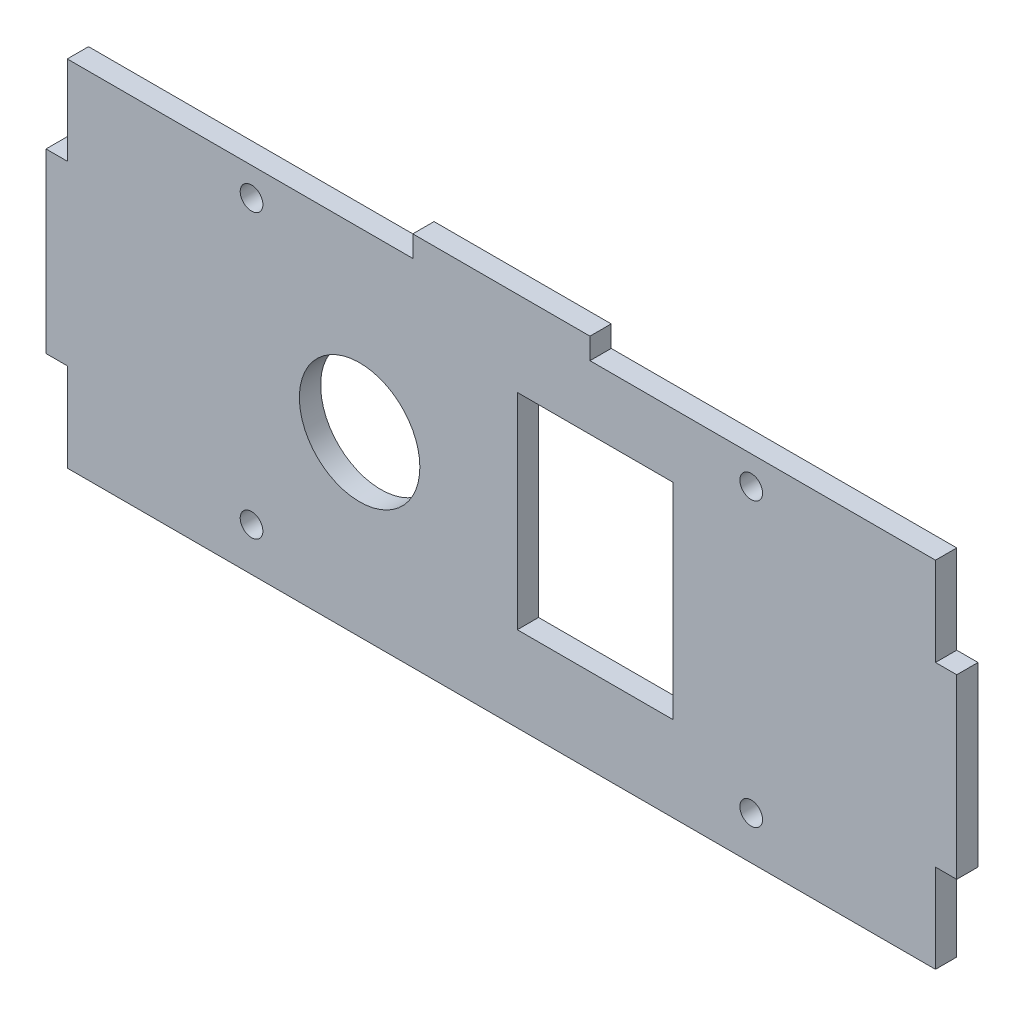
ISO-10303-21;
HEADER;
FILE_DESCRIPTION(('STEP AP214'),'2;1');
FILE_NAME('part.step','',(''),(''),'','','');
FILE_SCHEMA(('AUTOMOTIVE_DESIGN { 1 0 10303 214 1 1 1 1 }'));
ENDSEC;
DATA;
#1=APPLICATION_CONTEXT('core data for automotive mechanical design processes');
#2=APPLICATION_PROTOCOL_DEFINITION('international standard','automotive_design',2000,#1);
#3=PRODUCT_CONTEXT('',#1,'mechanical');
#4=PRODUCT('Part','Part','',(#3));
#5=PRODUCT_RELATED_PRODUCT_CATEGORY('part','',(#4));
#6=PRODUCT_DEFINITION_FORMATION('','',#4);
#7=PRODUCT_DEFINITION_CONTEXT('part definition',#1,'design');
#8=PRODUCT_DEFINITION('design','',#6,#7);
#9=PRODUCT_DEFINITION_SHAPE('','',#8);
#10=(LENGTH_UNIT() NAMED_UNIT(*) SI_UNIT(.MILLI.,.METRE.));
#11=(NAMED_UNIT(*) PLANE_ANGLE_UNIT() SI_UNIT($,.RADIAN.));
#12=(NAMED_UNIT(*) SI_UNIT($,.STERADIAN.) SOLID_ANGLE_UNIT());
#13=UNCERTAINTY_MEASURE_WITH_UNIT(LENGTH_MEASURE(1.E-05),#10,'distance_accuracy_value','');
#14=(GEOMETRIC_REPRESENTATION_CONTEXT(3) GLOBAL_UNCERTAINTY_ASSIGNED_CONTEXT((#13)) GLOBAL_UNIT_ASSIGNED_CONTEXT((#10,
#11,#12)) REPRESENTATION_CONTEXT('',''));
#15=CARTESIAN_POINT('',(0.,0.,0.));
#16=DIRECTION('',(0.,0.,1.));
#17=DIRECTION('',(1.,0.,0.));
#18=AXIS2_PLACEMENT_3D('',#15,#16,#17);
#19=CARTESIAN_POINT('',(-61.25,12.5,3.));
#20=DIRECTION('',(1.,0.,0.));
#21=DIRECTION('',(0.,0.,-1.));
#22=AXIS2_PLACEMENT_3D('',#19,#20,#21);
#23=PLANE('',#22);
#24=DIRECTION('',(0.,-1.,0.));
#25=VECTOR('',#24,1.);
#26=CARTESIAN_POINT('',(-61.25,12.5,0.));
#27=LINE('',#26,#25);
#28=CARTESIAN_POINT('',(-61.25,25.,0.));
#29=VERTEX_POINT('',#28);
#30=CARTESIAN_POINT('',(-61.25,12.5,0.));
#31=VERTEX_POINT('',#30);
#32=EDGE_CURVE('E230',#29,#31,#27,.T.);
#33=ORIENTED_EDGE('',*,*,#32,.T.);
#34=DIRECTION('',(0.,0.,-1.));
#35=VECTOR('',#34,1.);
#36=CARTESIAN_POINT('',(-61.25,12.5,3.));
#37=LINE('',#36,#35);
#38=CARTESIAN_POINT('',(-61.25,12.5,3.));
#39=VERTEX_POINT('',#38);
#40=EDGE_CURVE('E39',#39,#31,#37,.T.);
#41=ORIENTED_EDGE('',*,*,#40,.F.);
#42=DIRECTION('',(0.,-1.,0.));
#43=VECTOR('',#42,1.);
#44=CARTESIAN_POINT('',(-61.25,12.5,3.));
#45=LINE('',#44,#43);
#46=CARTESIAN_POINT('',(-61.25,25.,3.));
#47=VERTEX_POINT('',#46);
#48=EDGE_CURVE('E236',#47,#39,#45,.T.);
#49=ORIENTED_EDGE('',*,*,#48,.F.);
#50=DIRECTION('',(0.,0.,-1.));
#51=VECTOR('',#50,1.);
#52=CARTESIAN_POINT('',(-61.25,25.,3.));
#53=LINE('',#52,#51);
#54=EDGE_CURVE('E11',#47,#29,#53,.T.);
#55=ORIENTED_EDGE('',*,*,#54,.T.);
#56=EDGE_LOOP('',(#33,#41,#49,#55));
#57=FACE_BOUND('',#56,.T.);
#58=ADVANCED_FACE('F32',(#57),#23,.F.);
#59=CARTESIAN_POINT('',(-61.25,12.5,3.));
#60=DIRECTION('',(0.,-1.,0.));
#61=DIRECTION('',(1.,0.,0.));
#62=AXIS2_PLACEMENT_3D('',#59,#60,#61);
#63=PLANE('',#62);
#64=DIRECTION('',(-1.,0.,0.));
#65=VECTOR('',#64,1.);
#66=CARTESIAN_POINT('',(-61.25,12.5,0.));
#67=LINE('',#66,#65);
#68=CARTESIAN_POINT('',(-64.25,12.5,0.));
#69=VERTEX_POINT('',#68);
#70=EDGE_CURVE('E270',#31,#69,#67,.T.);
#71=ORIENTED_EDGE('',*,*,#70,.T.);
#72=DIRECTION('',(0.,0.,-1.));
#73=VECTOR('',#72,1.);
#74=CARTESIAN_POINT('',(-64.25,12.5,3.));
#75=LINE('',#74,#73);
#76=CARTESIAN_POINT('',(-64.25,12.5,3.));
#77=VERTEX_POINT('',#76);
#78=EDGE_CURVE('E339',#77,#69,#75,.T.);
#79=ORIENTED_EDGE('',*,*,#78,.F.);
#80=DIRECTION('',(-1.,0.,0.));
#81=VECTOR('',#80,1.);
#82=CARTESIAN_POINT('',(-61.25,12.5,3.));
#83=LINE('',#82,#81);
#84=EDGE_CURVE('E239',#39,#77,#83,.T.);
#85=ORIENTED_EDGE('',*,*,#84,.F.);
#86=ORIENTED_EDGE('',*,*,#40,.T.);
#87=EDGE_LOOP('',(#71,#79,#85,#86));
#88=FACE_BOUND('',#87,.T.);
#89=ADVANCED_FACE('F346',(#88),#63,.F.);
#90=CARTESIAN_POINT('',(-64.25,-12.5,3.));
#91=DIRECTION('',(1.,0.,0.));
#92=DIRECTION('',(0.,0.,-1.));
#93=AXIS2_PLACEMENT_3D('',#90,#91,#92);
#94=PLANE('',#93);
#95=DIRECTION('',(0.,-1.,0.));
#96=VECTOR('',#95,1.);
#97=CARTESIAN_POINT('',(-64.25,-12.5,0.));
#98=LINE('',#97,#96);
#99=CARTESIAN_POINT('',(-64.25,-12.5,0.));
#100=VERTEX_POINT('',#99);
#101=EDGE_CURVE('E272',#69,#100,#98,.T.);
#102=ORIENTED_EDGE('',*,*,#101,.T.);
#103=DIRECTION('',(0.,0.,-1.));
#104=VECTOR('',#103,1.);
#105=CARTESIAN_POINT('',(-64.25,-12.5,3.));
#106=LINE('',#105,#104);
#107=CARTESIAN_POINT('',(-64.25,-12.5,3.));
#108=VERTEX_POINT('',#107);
#109=EDGE_CURVE('E336',#108,#100,#106,.T.);
#110=ORIENTED_EDGE('',*,*,#109,.F.);
#111=DIRECTION('',(0.,-1.,0.));
#112=VECTOR('',#111,1.);
#113=CARTESIAN_POINT('',(-64.25,-12.5,3.));
#114=LINE('',#113,#112);
#115=EDGE_CURVE('E241',#77,#108,#114,.T.);
#116=ORIENTED_EDGE('',*,*,#115,.F.);
#117=ORIENTED_EDGE('',*,*,#78,.T.);
#118=EDGE_LOOP('',(#102,#110,#116,#117));
#119=FACE_BOUND('',#118,.T.);
#120=ADVANCED_FACE('F356',(#119),#94,.F.);
#121=CARTESIAN_POINT('',(-61.25,-12.5,3.));
#122=DIRECTION('',(0.,1.,0.));
#123=DIRECTION('',(0.,0.,1.));
#124=AXIS2_PLACEMENT_3D('',#121,#122,#123);
#125=PLANE('',#124);
#126=DIRECTION('',(1.,0.,0.));
#127=VECTOR('',#126,1.);
#128=CARTESIAN_POINT('',(-61.25,-12.5,0.));
#129=LINE('',#128,#127);
#130=CARTESIAN_POINT('',(-61.25,-12.5,0.));
#131=VERTEX_POINT('',#130);
#132=EDGE_CURVE('E274',#100,#131,#129,.T.);
#133=ORIENTED_EDGE('',*,*,#132,.T.);
#134=DIRECTION('',(0.,0.,-1.));
#135=VECTOR('',#134,1.);
#136=CARTESIAN_POINT('',(-61.25,-12.5,3.));
#137=LINE('',#136,#135);
#138=CARTESIAN_POINT('',(-61.25,-12.5,3.));
#139=VERTEX_POINT('',#138);
#140=EDGE_CURVE('E333',#139,#131,#137,.T.);
#141=ORIENTED_EDGE('',*,*,#140,.F.);
#142=DIRECTION('',(1.,0.,0.));
#143=VECTOR('',#142,1.);
#144=CARTESIAN_POINT('',(-61.25,-12.5,3.));
#145=LINE('',#144,#143);
#146=EDGE_CURVE('E243',#108,#139,#145,.T.);
#147=ORIENTED_EDGE('',*,*,#146,.F.);
#148=ORIENTED_EDGE('',*,*,#109,.T.);
#149=EDGE_LOOP('',(#133,#141,#147,#148));
#150=FACE_BOUND('',#149,.T.);
#151=ADVANCED_FACE('F360',(#150),#125,.F.);
#152=CARTESIAN_POINT('',(-61.25,-25.,3.));
#153=DIRECTION('',(1.,0.,0.));
#154=DIRECTION('',(0.,0.,-1.));
#155=AXIS2_PLACEMENT_3D('',#152,#153,#154);
#156=PLANE('',#155);
#157=DIRECTION('',(0.,-1.,0.));
#158=VECTOR('',#157,1.);
#159=CARTESIAN_POINT('',(-61.25,-25.,0.));
#160=LINE('',#159,#158);
#161=CARTESIAN_POINT('',(-61.25,-25.,0.));
#162=VERTEX_POINT('',#161);
#163=EDGE_CURVE('E276',#131,#162,#160,.T.);
#164=ORIENTED_EDGE('',*,*,#163,.T.);
#165=DIRECTION('',(0.,0.,-1.));
#166=VECTOR('',#165,1.);
#167=CARTESIAN_POINT('',(-61.25,-25.,3.));
#168=LINE('',#167,#166);
#169=CARTESIAN_POINT('',(-61.25,-25.,3.));
#170=VERTEX_POINT('',#169);
#171=EDGE_CURVE('E330',#170,#162,#168,.T.);
#172=ORIENTED_EDGE('',*,*,#171,.F.);
#173=DIRECTION('',(0.,-1.,0.));
#174=VECTOR('',#173,1.);
#175=CARTESIAN_POINT('',(-61.25,-25.,3.));
#176=LINE('',#175,#174);
#177=EDGE_CURVE('E245',#139,#170,#176,.T.);
#178=ORIENTED_EDGE('',*,*,#177,.F.);
#179=ORIENTED_EDGE('',*,*,#140,.T.);
#180=EDGE_LOOP('',(#164,#172,#178,#179));
#181=FACE_BOUND('',#180,.T.);
#182=ADVANCED_FACE('F419',(#181),#156,.F.);
#183=CARTESIAN_POINT('',(61.25,-25.,3.));
#184=DIRECTION('',(0.,1.,0.));
#185=DIRECTION('',(-1.,0.,0.));
#186=AXIS2_PLACEMENT_3D('',#183,#184,#185);
#187=PLANE('',#186);
#188=DIRECTION('',(1.,0.,0.));
#189=VECTOR('',#188,1.);
#190=CARTESIAN_POINT('',(61.25,-25.,0.));
#191=LINE('',#190,#189);
#192=CARTESIAN_POINT('',(61.25,-25.,0.));
#193=VERTEX_POINT('',#192);
#194=EDGE_CURVE('E278',#162,#193,#191,.T.);
#195=ORIENTED_EDGE('',*,*,#194,.T.);
#196=DIRECTION('',(0.,0.,-1.));
#197=VECTOR('',#196,1.);
#198=CARTESIAN_POINT('',(61.25,-25.,3.));
#199=LINE('',#198,#197);
#200=CARTESIAN_POINT('',(61.25,-25.,3.));
#201=VERTEX_POINT('',#200);
#202=EDGE_CURVE('E327',#201,#193,#199,.T.);
#203=ORIENTED_EDGE('',*,*,#202,.F.);
#204=DIRECTION('',(1.,0.,0.));
#205=VECTOR('',#204,1.);
#206=CARTESIAN_POINT('',(61.25,-25.,3.));
#207=LINE('',#206,#205);
#208=EDGE_CURVE('E247',#170,#201,#207,.T.);
#209=ORIENTED_EDGE('',*,*,#208,.F.);
#210=ORIENTED_EDGE('',*,*,#171,.T.);
#211=EDGE_LOOP('',(#195,#203,#209,#210));
#212=FACE_BOUND('',#211,.T.);
#213=ADVANCED_FACE('F417',(#212),#187,.F.);
#214=CARTESIAN_POINT('',(61.25,-25.,3.));
#215=DIRECTION('',(-1.,0.,0.));
#216=DIRECTION('',(0.,0.,1.));
#217=AXIS2_PLACEMENT_3D('',#214,#215,#216);
#218=PLANE('',#217);
#219=DIRECTION('',(0.,1.,0.));
#220=VECTOR('',#219,1.);
#221=CARTESIAN_POINT('',(61.25,-25.,0.));
#222=LINE('',#221,#220);
#223=CARTESIAN_POINT('',(61.25,-12.5,0.));
#224=VERTEX_POINT('',#223);
#225=EDGE_CURVE('E280',#193,#224,#222,.T.);
#226=ORIENTED_EDGE('',*,*,#225,.T.);
#227=DIRECTION('',(0.,0.,-1.));
#228=VECTOR('',#227,1.);
#229=CARTESIAN_POINT('',(61.25,-12.5,3.));
#230=LINE('',#229,#228);
#231=CARTESIAN_POINT('',(61.25,-12.5,3.));
#232=VERTEX_POINT('',#231);
#233=EDGE_CURVE('E324',#232,#224,#230,.T.);
#234=ORIENTED_EDGE('',*,*,#233,.F.);
#235=DIRECTION('',(0.,1.,0.));
#236=VECTOR('',#235,1.);
#237=CARTESIAN_POINT('',(61.25,-25.,3.));
#238=LINE('',#237,#236);
#239=EDGE_CURVE('E249',#201,#232,#238,.T.);
#240=ORIENTED_EDGE('',*,*,#239,.F.);
#241=ORIENTED_EDGE('',*,*,#202,.T.);
#242=EDGE_LOOP('',(#226,#234,#240,#241));
#243=FACE_BOUND('',#242,.T.);
#244=ADVANCED_FACE('F412',(#243),#218,.F.);
#245=CARTESIAN_POINT('',(61.25,-12.5,3.));
#246=DIRECTION('',(0.,1.,0.));
#247=DIRECTION('',(0.,0.,1.));
#248=AXIS2_PLACEMENT_3D('',#245,#246,#247);
#249=PLANE('',#248);
#250=DIRECTION('',(1.,0.,0.));
#251=VECTOR('',#250,1.);
#252=CARTESIAN_POINT('',(61.25,-12.5,0.));
#253=LINE('',#252,#251);
#254=CARTESIAN_POINT('',(64.25,-12.5,0.));
#255=VERTEX_POINT('',#254);
#256=EDGE_CURVE('E282',#224,#255,#253,.T.);
#257=ORIENTED_EDGE('',*,*,#256,.T.);
#258=DIRECTION('',(0.,0.,-1.));
#259=VECTOR('',#258,1.);
#260=CARTESIAN_POINT('',(64.25,-12.5,3.));
#261=LINE('',#260,#259);
#262=CARTESIAN_POINT('',(64.25,-12.5,3.));
#263=VERTEX_POINT('',#262);
#264=EDGE_CURVE('E321',#263,#255,#261,.T.);
#265=ORIENTED_EDGE('',*,*,#264,.F.);
#266=DIRECTION('',(1.,0.,0.));
#267=VECTOR('',#266,1.);
#268=CARTESIAN_POINT('',(61.25,-12.5,3.));
#269=LINE('',#268,#267);
#270=EDGE_CURVE('E251',#232,#263,#269,.T.);
#271=ORIENTED_EDGE('',*,*,#270,.F.);
#272=ORIENTED_EDGE('',*,*,#233,.T.);
#273=EDGE_LOOP('',(#257,#265,#271,#272));
#274=FACE_BOUND('',#273,.T.);
#275=ADVANCED_FACE('F407',(#274),#249,.F.);
#276=CARTESIAN_POINT('',(64.25,-12.5,3.));
#277=DIRECTION('',(-1.,0.,0.));
#278=DIRECTION('',(0.,-1.,0.));
#279=AXIS2_PLACEMENT_3D('',#276,#277,#278);
#280=PLANE('',#279);
#281=DIRECTION('',(0.,1.,0.));
#282=VECTOR('',#281,1.);
#283=CARTESIAN_POINT('',(64.25,-12.5,0.));
#284=LINE('',#283,#282);
#285=CARTESIAN_POINT('',(64.25,12.5,0.));
#286=VERTEX_POINT('',#285);
#287=EDGE_CURVE('E284',#255,#286,#284,.T.);
#288=ORIENTED_EDGE('',*,*,#287,.T.);
#289=DIRECTION('',(0.,0.,-1.));
#290=VECTOR('',#289,1.);
#291=CARTESIAN_POINT('',(64.25,12.5,3.));
#292=LINE('',#291,#290);
#293=CARTESIAN_POINT('',(64.25,12.5,3.));
#294=VERTEX_POINT('',#293);
#295=EDGE_CURVE('E318',#294,#286,#292,.T.);
#296=ORIENTED_EDGE('',*,*,#295,.F.);
#297=DIRECTION('',(0.,1.,0.));
#298=VECTOR('',#297,1.);
#299=CARTESIAN_POINT('',(64.25,-12.5,3.));
#300=LINE('',#299,#298);
#301=EDGE_CURVE('E253',#263,#294,#300,.T.);
#302=ORIENTED_EDGE('',*,*,#301,.F.);
#303=ORIENTED_EDGE('',*,*,#264,.T.);
#304=EDGE_LOOP('',(#288,#296,#302,#303));
#305=FACE_BOUND('',#304,.T.);
#306=ADVANCED_FACE('F403',(#305),#280,.F.);
#307=CARTESIAN_POINT('',(61.25,12.5,3.));
#308=DIRECTION('',(0.,-1.,0.));
#309=DIRECTION('',(1.,0.,0.));
#310=AXIS2_PLACEMENT_3D('',#307,#308,#309);
#311=PLANE('',#310);
#312=DIRECTION('',(-1.,0.,0.));
#313=VECTOR('',#312,1.);
#314=CARTESIAN_POINT('',(61.25,12.5,0.));
#315=LINE('',#314,#313);
#316=CARTESIAN_POINT('',(61.25,12.5,0.));
#317=VERTEX_POINT('',#316);
#318=EDGE_CURVE('E286',#286,#317,#315,.T.);
#319=ORIENTED_EDGE('',*,*,#318,.T.);
#320=DIRECTION('',(0.,0.,-1.));
#321=VECTOR('',#320,1.);
#322=CARTESIAN_POINT('',(61.25,12.5,3.));
#323=LINE('',#322,#321);
#324=CARTESIAN_POINT('',(61.25,12.5,3.));
#325=VERTEX_POINT('',#324);
#326=EDGE_CURVE('E315',#325,#317,#323,.T.);
#327=ORIENTED_EDGE('',*,*,#326,.F.);
#328=DIRECTION('',(-1.,0.,0.));
#329=VECTOR('',#328,1.);
#330=CARTESIAN_POINT('',(61.25,12.5,3.));
#331=LINE('',#330,#329);
#332=EDGE_CURVE('E255',#294,#325,#331,.T.);
#333=ORIENTED_EDGE('',*,*,#332,.F.);
#334=ORIENTED_EDGE('',*,*,#295,.T.);
#335=EDGE_LOOP('',(#319,#327,#333,#334));
#336=FACE_BOUND('',#335,.T.);
#337=ADVANCED_FACE('F398',(#336),#311,.F.);
#338=CARTESIAN_POINT('',(61.25,12.5,3.));
#339=DIRECTION('',(-1.,0.,0.));
#340=DIRECTION('',(0.,-1.,0.));
#341=AXIS2_PLACEMENT_3D('',#338,#339,#340);
#342=PLANE('',#341);
#343=DIRECTION('',(0.,1.,0.));
#344=VECTOR('',#343,1.);
#345=CARTESIAN_POINT('',(61.25,12.5,0.));
#346=LINE('',#345,#344);
#347=CARTESIAN_POINT('',(61.25,25.,0.));
#348=VERTEX_POINT('',#347);
#349=EDGE_CURVE('E288',#317,#348,#346,.T.);
#350=ORIENTED_EDGE('',*,*,#349,.T.);
#351=DIRECTION('',(0.,0.,-1.));
#352=VECTOR('',#351,1.);
#353=CARTESIAN_POINT('',(61.25,25.,3.));
#354=LINE('',#353,#352);
#355=CARTESIAN_POINT('',(61.25,25.,3.));
#356=VERTEX_POINT('',#355);
#357=EDGE_CURVE('E312',#356,#348,#354,.T.);
#358=ORIENTED_EDGE('',*,*,#357,.F.);
#359=DIRECTION('',(0.,1.,0.));
#360=VECTOR('',#359,1.);
#361=CARTESIAN_POINT('',(61.25,12.5,3.));
#362=LINE('',#361,#360);
#363=EDGE_CURVE('E257',#325,#356,#362,.T.);
#364=ORIENTED_EDGE('',*,*,#363,.F.);
#365=ORIENTED_EDGE('',*,*,#326,.T.);
#366=EDGE_LOOP('',(#350,#358,#364,#365));
#367=FACE_BOUND('',#366,.T.);
#368=ADVANCED_FACE('F392',(#367),#342,.F.);
#369=CARTESIAN_POINT('',(26.65,25.,3.));
#370=DIRECTION('',(0.,-1.,0.));
#371=DIRECTION('',(0.,0.,-1.));
#372=AXIS2_PLACEMENT_3D('',#369,#370,#371);
#373=PLANE('',#372);
#374=DIRECTION('',(-1.,0.,0.));
#375=VECTOR('',#374,1.);
#376=CARTESIAN_POINT('',(26.65,25.,0.));
#377=LINE('',#376,#375);
#378=CARTESIAN_POINT('',(12.5,25.,0.));
#379=VERTEX_POINT('',#378);
#380=EDGE_CURVE('E291',#348,#379,#377,.T.);
#381=ORIENTED_EDGE('',*,*,#380,.T.);
#382=DIRECTION('',(0.,0.,-1.));
#383=VECTOR('',#382,1.);
#384=CARTESIAN_POINT('',(12.5,25.,3.));
#385=LINE('',#384,#383);
#386=CARTESIAN_POINT('',(12.5,25.,3.));
#387=VERTEX_POINT('',#386);
#388=EDGE_CURVE('E309',#387,#379,#385,.T.);
#389=ORIENTED_EDGE('',*,*,#388,.F.);
#390=DIRECTION('',(-1.,0.,0.));
#391=VECTOR('',#390,1.);
#392=CARTESIAN_POINT('',(61.25,25.,3.));
#393=LINE('',#392,#391);
#394=EDGE_CURVE('E259',#356,#387,#393,.T.);
#395=ORIENTED_EDGE('',*,*,#394,.F.);
#396=ORIENTED_EDGE('',*,*,#357,.T.);
#397=EDGE_LOOP('',(#381,#389,#395,#396));
#398=FACE_BOUND('',#397,.T.);
#399=ADVANCED_FACE('F388',(#398),#373,.F.);
#400=CARTESIAN_POINT('',(12.5,25.,3.));
#401=DIRECTION('',(-1.,0.,0.));
#402=DIRECTION('',(0.,0.,1.));
#403=AXIS2_PLACEMENT_3D('',#400,#401,#402);
#404=PLANE('',#403);
#405=DIRECTION('',(0.,1.,0.));
#406=VECTOR('',#405,1.);
#407=CARTESIAN_POINT('',(12.5,25.,0.));
#408=LINE('',#407,#406);
#409=CARTESIAN_POINT('',(12.5,28.,0.));
#410=VERTEX_POINT('',#409);
#411=EDGE_CURVE('E293',#379,#410,#408,.T.);
#412=ORIENTED_EDGE('',*,*,#411,.T.);
#413=DIRECTION('',(0.,0.,-1.));
#414=VECTOR('',#413,1.);
#415=CARTESIAN_POINT('',(12.5,28.,3.));
#416=LINE('',#415,#414);
#417=CARTESIAN_POINT('',(12.5,28.,3.));
#418=VERTEX_POINT('',#417);
#419=EDGE_CURVE('E306',#418,#410,#416,.T.);
#420=ORIENTED_EDGE('',*,*,#419,.F.);
#421=DIRECTION('',(0.,1.,0.));
#422=VECTOR('',#421,1.);
#423=CARTESIAN_POINT('',(12.5,25.,3.));
#424=LINE('',#423,#422);
#425=EDGE_CURVE('E261',#387,#418,#424,.T.);
#426=ORIENTED_EDGE('',*,*,#425,.F.);
#427=ORIENTED_EDGE('',*,*,#388,.T.);
#428=EDGE_LOOP('',(#412,#420,#426,#427));
#429=FACE_BOUND('',#428,.T.);
#430=ADVANCED_FACE('F383',(#429),#404,.F.);
#431=CARTESIAN_POINT('',(-12.5,28.,3.));
#432=DIRECTION('',(0.,-1.,0.));
#433=DIRECTION('',(1.,0.,0.));
#434=AXIS2_PLACEMENT_3D('',#431,#432,#433);
#435=PLANE('',#434);
#436=DIRECTION('',(-1.,0.,0.));
#437=VECTOR('',#436,1.);
#438=CARTESIAN_POINT('',(-12.5,28.,0.));
#439=LINE('',#438,#437);
#440=CARTESIAN_POINT('',(-12.5,28.,0.));
#441=VERTEX_POINT('',#440);
#442=EDGE_CURVE('E295',#410,#441,#439,.T.);
#443=ORIENTED_EDGE('',*,*,#442,.T.);
#444=DIRECTION('',(0.,0.,-1.));
#445=VECTOR('',#444,1.);
#446=CARTESIAN_POINT('',(-12.5,28.,3.));
#447=LINE('',#446,#445);
#448=CARTESIAN_POINT('',(-12.5,28.,3.));
#449=VERTEX_POINT('',#448);
#450=EDGE_CURVE('E303',#449,#441,#447,.T.);
#451=ORIENTED_EDGE('',*,*,#450,.F.);
#452=DIRECTION('',(-1.,0.,0.));
#453=VECTOR('',#452,1.);
#454=CARTESIAN_POINT('',(-12.5,28.,3.));
#455=LINE('',#454,#453);
#456=EDGE_CURVE('E263',#418,#449,#455,.T.);
#457=ORIENTED_EDGE('',*,*,#456,.F.);
#458=ORIENTED_EDGE('',*,*,#419,.T.);
#459=EDGE_LOOP('',(#443,#451,#457,#458));
#460=FACE_BOUND('',#459,.T.);
#461=ADVANCED_FACE('F378',(#460),#435,.F.);
#462=CARTESIAN_POINT('',(-12.5,25.,3.));
#463=DIRECTION('',(1.,0.,0.));
#464=DIRECTION('',(0.,0.,-1.));
#465=AXIS2_PLACEMENT_3D('',#462,#463,#464);
#466=PLANE('',#465);
#467=DIRECTION('',(0.,-1.,0.));
#468=VECTOR('',#467,1.);
#469=CARTESIAN_POINT('',(-12.5,25.,0.));
#470=LINE('',#469,#468);
#471=CARTESIAN_POINT('',(-12.5,25.,0.));
#472=VERTEX_POINT('',#471);
#473=EDGE_CURVE('E297',#441,#472,#470,.T.);
#474=ORIENTED_EDGE('',*,*,#473,.T.);
#475=DIRECTION('',(0.,0.,-1.));
#476=VECTOR('',#475,1.);
#477=CARTESIAN_POINT('',(-12.5,25.,3.));
#478=LINE('',#477,#476);
#479=CARTESIAN_POINT('',(-12.5,25.,3.));
#480=VERTEX_POINT('',#479);
#481=EDGE_CURVE('E268',#480,#472,#478,.T.);
#482=ORIENTED_EDGE('',*,*,#481,.F.);
#483=DIRECTION('',(0.,-1.,0.));
#484=VECTOR('',#483,1.);
#485=CARTESIAN_POINT('',(-12.5,25.,3.));
#486=LINE('',#485,#484);
#487=EDGE_CURVE('E265',#449,#480,#486,.T.);
#488=ORIENTED_EDGE('',*,*,#487,.F.);
#489=ORIENTED_EDGE('',*,*,#450,.T.);
#490=EDGE_LOOP('',(#474,#482,#488,#489));
#491=FACE_BOUND('',#490,.T.);
#492=ADVANCED_FACE('F373',(#491),#466,.F.);
#493=CARTESIAN_POINT('',(-29.85,25.,3.));
#494=DIRECTION('',(0.,-1.,0.));
#495=DIRECTION('',(1.,0.,0.));
#496=AXIS2_PLACEMENT_3D('',#493,#494,#495);
#497=PLANE('',#496);
#498=DIRECTION('',(-1.,0.,0.));
#499=VECTOR('',#498,1.);
#500=CARTESIAN_POINT('',(-29.85,25.,0.));
#501=LINE('',#500,#499);
#502=EDGE_CURVE('E237',#472,#29,#501,.T.);
#503=ORIENTED_EDGE('',*,*,#502,.T.);
#504=ORIENTED_EDGE('',*,*,#54,.F.);
#505=DIRECTION('',(-1.,0.,0.));
#506=VECTOR('',#505,1.);
#507=CARTESIAN_POINT('',(-29.85,25.,3.));
#508=LINE('',#507,#506);
#509=EDGE_CURVE('E233',#480,#47,#508,.T.);
#510=ORIENTED_EDGE('',*,*,#509,.F.);
#511=ORIENTED_EDGE('',*,*,#481,.T.);
#512=EDGE_LOOP('',(#503,#504,#510,#511));
#513=FACE_BOUND('',#512,.T.);
#514=ADVANCED_FACE('F368',(#513),#497,.F.);
#515=CARTESIAN_POINT('',(0.,0.,3.));
#516=DIRECTION('',(0.,0.,-1.));
#517=DIRECTION('',(-1.,0.,0.));
#518=AXIS2_PLACEMENT_3D('',#515,#516,#517);
#519=PLANE('',#518);
#520=CARTESIAN_POINT('',(-20.,0.,3.));
#521=DIRECTION('',(0.,0.,1.));
#522=DIRECTION('',(1.,0.,0.));
#523=AXIS2_PLACEMENT_3D('',#520,#521,#522);
#524=CIRCLE('',#523,8.5);
#525=CARTESIAN_POINT('',(-11.5,0.,3.));
#526=VERTEX_POINT('',#525);
#527=EDGE_CURVE('E192',#526,#526,#524,.T.);
#528=ORIENTED_EDGE('',*,*,#527,.F.);
#529=EDGE_LOOP('',(#528));
#530=FACE_BOUND('',#529,.T.);
#531=DIRECTION('',(1.,0.,0.));
#532=VECTOR('',#531,1.);
#533=CARTESIAN_POINT('',(2.25000000000024,-12.9999999999995,3.));
#534=LINE('',#533,#532);
#535=CARTESIAN_POINT('',(2.25000000000024,-12.9999999999995,3.));
#536=VERTEX_POINT('',#535);
#537=CARTESIAN_POINT('',(24.2500000000002,-12.9999999999995,3.));
#538=VERTEX_POINT('',#537);
#539=EDGE_CURVE('E198',#536,#538,#534,.T.);
#540=ORIENTED_EDGE('',*,*,#539,.F.);
#541=DIRECTION('',(0.,-1.,0.));
#542=VECTOR('',#541,1.);
#543=CARTESIAN_POINT('',(2.25000000000024,16.0000000000005,3.));
#544=LINE('',#543,#542);
#545=CARTESIAN_POINT('',(2.25000000000024,16.0000000000005,3.));
#546=VERTEX_POINT('',#545);
#547=EDGE_CURVE('E46',#546,#536,#544,.T.);
#548=ORIENTED_EDGE('',*,*,#547,.F.);
#549=DIRECTION('',(-1.,0.,0.));
#550=VECTOR('',#549,1.);
#551=CARTESIAN_POINT('',(2.25000000000024,16.0000000000005,3.));
#552=LINE('',#551,#550);
#553=CARTESIAN_POINT('',(24.2500000000002,16.0000000000005,3.));
#554=VERTEX_POINT('',#553);
#555=EDGE_CURVE('E186',#554,#546,#552,.T.);
#556=ORIENTED_EDGE('',*,*,#555,.F.);
#557=DIRECTION('',(0.,1.,0.));
#558=VECTOR('',#557,1.);
#559=CARTESIAN_POINT('',(24.2500000000002,16.0000000000005,3.));
#560=LINE('',#559,#558);
#561=EDGE_CURVE('E189',#538,#554,#560,.T.);
#562=ORIENTED_EDGE('',*,*,#561,.F.);
#563=EDGE_LOOP('',(#540,#548,#556,#562));
#564=FACE_BOUND('',#563,.T.);
#565=CARTESIAN_POINT('',(-35.2500000000001,-18.8999999999981,3.));
#566=DIRECTION('',(0.,0.,-1.));
#567=DIRECTION('',(-1.,0.,0.));
#568=AXIS2_PLACEMENT_3D('',#565,#566,#567);
#569=CIRCLE('',#568,1.60000000000049);
#570=CARTESIAN_POINT('',(-36.8500000000006,-18.8999999999981,3.));
#571=VERTEX_POINT('',#570);
#572=EDGE_CURVE('E209',#571,#571,#569,.T.);
#573=ORIENTED_EDGE('',*,*,#572,.T.);
#574=EDGE_LOOP('',(#573));
#575=FACE_BOUND('',#574,.T.);
#576=CARTESIAN_POINT('',(35.2500000000003,-18.8999999999993,3.));
#577=DIRECTION('',(0.,0.,-1.));
#578=DIRECTION('',(-1.,0.,0.));
#579=AXIS2_PLACEMENT_3D('',#576,#577,#578);
#580=CIRCLE('',#579,1.60000000000016);
#581=CARTESIAN_POINT('',(33.6500000000001,-18.8999999999993,3.));
#582=VERTEX_POINT('',#581);
#583=EDGE_CURVE('E216',#582,#582,#580,.T.);
#584=ORIENTED_EDGE('',*,*,#583,.T.);
#585=EDGE_LOOP('',(#584));
#586=FACE_BOUND('',#585,.T.);
#587=CARTESIAN_POINT('',(35.2500000000001,21.0000000000007,3.));
#588=DIRECTION('',(0.,0.,-1.));
#589=DIRECTION('',(-1.,0.,0.));
#590=AXIS2_PLACEMENT_3D('',#587,#588,#589);
#591=CIRCLE('',#590,1.6);
#592=CARTESIAN_POINT('',(33.6500000000001,21.0000000000007,3.));
#593=VERTEX_POINT('',#592);
#594=EDGE_CURVE('E221',#593,#593,#591,.T.);
#595=ORIENTED_EDGE('',*,*,#594,.T.);
#596=EDGE_LOOP('',(#595));
#597=FACE_BOUND('',#596,.T.);
#598=CARTESIAN_POINT('',(-35.25,21.0000000000014,3.));
#599=DIRECTION('',(0.,0.,-1.));
#600=DIRECTION('',(-1.,0.,0.));
#601=AXIS2_PLACEMENT_3D('',#598,#599,#600);
#602=CIRCLE('',#601,1.6);
#603=CARTESIAN_POINT('',(-36.85,21.0000000000014,3.));
#604=VERTEX_POINT('',#603);
#605=EDGE_CURVE('E227',#604,#604,#602,.T.);
#606=ORIENTED_EDGE('',*,*,#605,.T.);
#607=EDGE_LOOP('',(#606));
#608=FACE_BOUND('',#607,.T.);
#609=ORIENTED_EDGE('',*,*,#509,.T.);
#610=ORIENTED_EDGE('',*,*,#48,.T.);
#611=ORIENTED_EDGE('',*,*,#84,.T.);
#612=ORIENTED_EDGE('',*,*,#115,.T.);
#613=ORIENTED_EDGE('',*,*,#146,.T.);
#614=ORIENTED_EDGE('',*,*,#177,.T.);
#615=ORIENTED_EDGE('',*,*,#208,.T.);
#616=ORIENTED_EDGE('',*,*,#239,.T.);
#617=ORIENTED_EDGE('',*,*,#270,.T.);
#618=ORIENTED_EDGE('',*,*,#301,.T.);
#619=ORIENTED_EDGE('',*,*,#332,.T.);
#620=ORIENTED_EDGE('',*,*,#363,.T.);
#621=ORIENTED_EDGE('',*,*,#394,.T.);
#622=ORIENTED_EDGE('',*,*,#425,.T.);
#623=ORIENTED_EDGE('',*,*,#456,.T.);
#624=ORIENTED_EDGE('',*,*,#487,.T.);
#625=EDGE_LOOP('',(#609,#610,#611,#612,#613,#614,#615,#616,#617,#618,#619,#620,#621,#622,#623,#624));
#626=FACE_BOUND('',#625,.T.);
#627=ADVANCED_FACE('F364',(#530,#564,#575,#586,#597,#608,#626),#519,.F.);
#628=CARTESIAN_POINT('',(0.,0.,0.));
#629=DIRECTION('',(0.,0.,-1.));
#630=DIRECTION('',(-1.,0.,0.));
#631=AXIS2_PLACEMENT_3D('',#628,#629,#630);
#632=PLANE('',#631);
#633=CARTESIAN_POINT('',(-20.,0.,0.));
#634=DIRECTION('',(0.,0.,1.));
#635=DIRECTION('',(1.,0.,0.));
#636=AXIS2_PLACEMENT_3D('',#633,#634,#635);
#637=CIRCLE('',#636,8.5);
#638=CARTESIAN_POINT('',(-11.5,0.,0.));
#639=VERTEX_POINT('',#638);
#640=EDGE_CURVE('E199',#639,#639,#637,.T.);
#641=ORIENTED_EDGE('',*,*,#640,.T.);
#642=EDGE_LOOP('',(#641));
#643=FACE_BOUND('',#642,.T.);
#644=DIRECTION('',(0.,-1.,0.));
#645=VECTOR('',#644,1.);
#646=CARTESIAN_POINT('',(2.25000000000024,16.0000000000005,0.));
#647=LINE('',#646,#645);
#648=CARTESIAN_POINT('',(2.25000000000024,16.0000000000005,0.));
#649=VERTEX_POINT('',#648);
#650=CARTESIAN_POINT('',(2.25000000000024,-12.9999999999995,0.));
#651=VERTEX_POINT('',#650);
#652=EDGE_CURVE('E170',#649,#651,#647,.T.);
#653=ORIENTED_EDGE('',*,*,#652,.T.);
#654=DIRECTION('',(1.,0.,0.));
#655=VECTOR('',#654,1.);
#656=CARTESIAN_POINT('',(2.25000000000024,-12.9999999999995,0.));
#657=LINE('',#656,#655);
#658=CARTESIAN_POINT('',(24.2500000000002,-12.9999999999995,0.));
#659=VERTEX_POINT('',#658);
#660=EDGE_CURVE('E179',#651,#659,#657,.T.);
#661=ORIENTED_EDGE('',*,*,#660,.T.);
#662=DIRECTION('',(0.,1.,0.));
#663=VECTOR('',#662,1.);
#664=CARTESIAN_POINT('',(24.2500000000002,16.0000000000005,0.));
#665=LINE('',#664,#663);
#666=CARTESIAN_POINT('',(24.2500000000002,16.0000000000005,0.));
#667=VERTEX_POINT('',#666);
#668=EDGE_CURVE('E54',#659,#667,#665,.T.);
#669=ORIENTED_EDGE('',*,*,#668,.T.);
#670=DIRECTION('',(-1.,0.,0.));
#671=VECTOR('',#670,1.);
#672=CARTESIAN_POINT('',(2.25000000000024,16.0000000000005,0.));
#673=LINE('',#672,#671);
#674=EDGE_CURVE('E176',#667,#649,#673,.T.);
#675=ORIENTED_EDGE('',*,*,#674,.T.);
#676=EDGE_LOOP('',(#653,#661,#669,#675));
#677=FACE_BOUND('',#676,.T.);
#678=CARTESIAN_POINT('',(-35.2500000000001,-18.8999999999981,0.));
#679=DIRECTION('',(0.,0.,-1.));
#680=DIRECTION('',(-1.,0.,0.));
#681=AXIS2_PLACEMENT_3D('',#678,#679,#680);
#682=CIRCLE('',#681,1.60000000000049);
#683=CARTESIAN_POINT('',(-36.8500000000006,-18.8999999999981,0.));
#684=VERTEX_POINT('',#683);
#685=EDGE_CURVE('E213',#684,#684,#682,.T.);
#686=ORIENTED_EDGE('',*,*,#685,.F.);
#687=EDGE_LOOP('',(#686));
#688=FACE_BOUND('',#687,.T.);
#689=CARTESIAN_POINT('',(35.2500000000003,-18.8999999999993,0.));
#690=DIRECTION('',(0.,0.,-1.));
#691=DIRECTION('',(-1.,0.,0.));
#692=AXIS2_PLACEMENT_3D('',#689,#690,#691);
#693=CIRCLE('',#692,1.60000000000016);
#694=CARTESIAN_POINT('',(33.6500000000001,-18.8999999999993,0.));
#695=VERTEX_POINT('',#694);
#696=EDGE_CURVE('E205',#695,#695,#693,.T.);
#697=ORIENTED_EDGE('',*,*,#696,.F.);
#698=EDGE_LOOP('',(#697));
#699=FACE_BOUND('',#698,.T.);
#700=CARTESIAN_POINT('',(35.2500000000001,21.0000000000007,0.));
#701=DIRECTION('',(0.,0.,-1.));
#702=DIRECTION('',(-1.,0.,0.));
#703=AXIS2_PLACEMENT_3D('',#700,#701,#702);
#704=CIRCLE('',#703,1.6);
#705=CARTESIAN_POINT('',(33.6500000000001,21.0000000000007,0.));
#706=VERTEX_POINT('',#705);
#707=EDGE_CURVE('E212',#706,#706,#704,.T.);
#708=ORIENTED_EDGE('',*,*,#707,.F.);
#709=EDGE_LOOP('',(#708));
#710=FACE_BOUND('',#709,.T.);
#711=CARTESIAN_POINT('',(-35.25,21.0000000000014,0.));
#712=DIRECTION('',(0.,0.,-1.));
#713=DIRECTION('',(-1.,0.,0.));
#714=AXIS2_PLACEMENT_3D('',#711,#712,#713);
#715=CIRCLE('',#714,1.6);
#716=CARTESIAN_POINT('',(-36.85,21.0000000000014,0.));
#717=VERTEX_POINT('',#716);
#718=EDGE_CURVE('E224',#717,#717,#715,.T.);
#719=ORIENTED_EDGE('',*,*,#718,.F.);
#720=EDGE_LOOP('',(#719));
#721=FACE_BOUND('',#720,.T.);
#722=ORIENTED_EDGE('',*,*,#32,.F.);
#723=ORIENTED_EDGE('',*,*,#502,.F.);
#724=ORIENTED_EDGE('',*,*,#473,.F.);
#725=ORIENTED_EDGE('',*,*,#442,.F.);
#726=ORIENTED_EDGE('',*,*,#411,.F.);
#727=ORIENTED_EDGE('',*,*,#380,.F.);
#728=ORIENTED_EDGE('',*,*,#349,.F.);
#729=ORIENTED_EDGE('',*,*,#318,.F.);
#730=ORIENTED_EDGE('',*,*,#287,.F.);
#731=ORIENTED_EDGE('',*,*,#256,.F.);
#732=ORIENTED_EDGE('',*,*,#225,.F.);
#733=ORIENTED_EDGE('',*,*,#194,.F.);
#734=ORIENTED_EDGE('',*,*,#163,.F.);
#735=ORIENTED_EDGE('',*,*,#132,.F.);
#736=ORIENTED_EDGE('',*,*,#101,.F.);
#737=ORIENTED_EDGE('',*,*,#70,.F.);
#738=EDGE_LOOP('',(#722,#723,#724,#725,#726,#727,#728,#729,#730,#731,#732,#733,#734,#735,#736,#737));
#739=FACE_BOUND('',#738,.T.);
#740=ADVANCED_FACE('F183',(#643,#677,#688,#699,#710,#721,#739),#632,.T.);
#741=CARTESIAN_POINT('',(-35.25,21.0000000000014,3.));
#742=DIRECTION('',(0.,0.,-1.));
#743=DIRECTION('',(-1.,0.,0.));
#744=AXIS2_PLACEMENT_3D('',#741,#742,#743);
#745=CYLINDRICAL_SURFACE('',#744,1.6);
#746=ORIENTED_EDGE('',*,*,#605,.F.);
#747=EDGE_LOOP('',(#746));
#748=FACE_BOUND('',#747,.T.);
#749=ORIENTED_EDGE('',*,*,#718,.T.);
#750=EDGE_LOOP('',(#749));
#751=FACE_BOUND('',#750,.T.);
#752=ADVANCED_FACE('F543',(#748,#751),#745,.F.);
#753=CARTESIAN_POINT('',(35.2500000000001,21.0000000000007,3.));
#754=DIRECTION('',(0.,0.,-1.));
#755=DIRECTION('',(-1.,0.,0.));
#756=AXIS2_PLACEMENT_3D('',#753,#754,#755);
#757=CYLINDRICAL_SURFACE('',#756,1.6);
#758=ORIENTED_EDGE('',*,*,#594,.F.);
#759=EDGE_LOOP('',(#758));
#760=FACE_BOUND('',#759,.T.);
#761=ORIENTED_EDGE('',*,*,#707,.T.);
#762=EDGE_LOOP('',(#761));
#763=FACE_BOUND('',#762,.T.);
#764=ADVANCED_FACE('F548',(#760,#763),#757,.F.);
#765=CARTESIAN_POINT('',(35.2500000000003,-18.8999999999993,3.));
#766=DIRECTION('',(0.,0.,-1.));
#767=DIRECTION('',(-1.,0.,0.));
#768=AXIS2_PLACEMENT_3D('',#765,#766,#767);
#769=CYLINDRICAL_SURFACE('',#768,1.60000000000016);
#770=ORIENTED_EDGE('',*,*,#583,.F.);
#771=EDGE_LOOP('',(#770));
#772=FACE_BOUND('',#771,.T.);
#773=ORIENTED_EDGE('',*,*,#696,.T.);
#774=EDGE_LOOP('',(#773));
#775=FACE_BOUND('',#774,.T.);
#776=ADVANCED_FACE('F560',(#772,#775),#769,.F.);
#777=CARTESIAN_POINT('',(-35.2500000000001,-18.8999999999981,3.));
#778=DIRECTION('',(0.,0.,-1.));
#779=DIRECTION('',(-1.,0.,0.));
#780=AXIS2_PLACEMENT_3D('',#777,#778,#779);
#781=CYLINDRICAL_SURFACE('',#780,1.60000000000049);
#782=ORIENTED_EDGE('',*,*,#572,.F.);
#783=EDGE_LOOP('',(#782));
#784=FACE_BOUND('',#783,.T.);
#785=ORIENTED_EDGE('',*,*,#685,.T.);
#786=EDGE_LOOP('',(#785));
#787=FACE_BOUND('',#786,.T.);
#788=ADVANCED_FACE('F570',(#784,#787),#781,.F.);
#789=CARTESIAN_POINT('',(2.25000000000024,16.0000000000005,0.));
#790=DIRECTION('',(-1.,0.,0.));
#791=DIRECTION('',(0.,0.,1.));
#792=AXIS2_PLACEMENT_3D('',#789,#790,#791);
#793=PLANE('',#792);
#794=ORIENTED_EDGE('',*,*,#547,.T.);
#795=DIRECTION('',(0.,0.,1.));
#796=VECTOR('',#795,1.);
#797=CARTESIAN_POINT('',(2.25000000000024,-12.9999999999995,0.));
#798=LINE('',#797,#796);
#799=EDGE_CURVE('E166',#651,#536,#798,.T.);
#800=ORIENTED_EDGE('',*,*,#799,.F.);
#801=ORIENTED_EDGE('',*,*,#652,.F.);
#802=DIRECTION('',(0.,0.,1.));
#803=VECTOR('',#802,1.);
#804=CARTESIAN_POINT('',(2.25000000000024,16.0000000000005,0.));
#805=LINE('',#804,#803);
#806=EDGE_CURVE('E203',#649,#546,#805,.T.);
#807=ORIENTED_EDGE('',*,*,#806,.T.);
#808=EDGE_LOOP('',(#794,#800,#801,#807));
#809=FACE_BOUND('',#808,.T.);
#810=ADVANCED_FACE('F168',(#809),#793,.F.);
#811=CARTESIAN_POINT('',(2.25000000000024,16.0000000000005,0.));
#812=DIRECTION('',(0.,1.,0.));
#813=DIRECTION('',(0.,0.,1.));
#814=AXIS2_PLACEMENT_3D('',#811,#812,#813);
#815=PLANE('',#814);
#816=ORIENTED_EDGE('',*,*,#555,.T.);
#817=ORIENTED_EDGE('',*,*,#806,.F.);
#818=ORIENTED_EDGE('',*,*,#674,.F.);
#819=DIRECTION('',(0.,0.,1.));
#820=VECTOR('',#819,1.);
#821=CARTESIAN_POINT('',(24.2500000000002,16.0000000000005,0.));
#822=LINE('',#821,#820);
#823=EDGE_CURVE('E206',#667,#554,#822,.T.);
#824=ORIENTED_EDGE('',*,*,#823,.T.);
#825=EDGE_LOOP('',(#816,#817,#818,#824));
#826=FACE_BOUND('',#825,.T.);
#827=ADVANCED_FACE('F589',(#826),#815,.F.);
#828=CARTESIAN_POINT('',(24.2500000000002,16.0000000000005,0.));
#829=DIRECTION('',(1.,0.,0.));
#830=DIRECTION('',(0.,0.,-1.));
#831=AXIS2_PLACEMENT_3D('',#828,#829,#830);
#832=PLANE('',#831);
#833=ORIENTED_EDGE('',*,*,#561,.T.);
#834=ORIENTED_EDGE('',*,*,#823,.F.);
#835=ORIENTED_EDGE('',*,*,#668,.F.);
#836=DIRECTION('',(0.,0.,1.));
#837=VECTOR('',#836,1.);
#838=CARTESIAN_POINT('',(24.2500000000002,-12.9999999999995,0.));
#839=LINE('',#838,#837);
#840=EDGE_CURVE('E175',#659,#538,#839,.T.);
#841=ORIENTED_EDGE('',*,*,#840,.T.);
#842=EDGE_LOOP('',(#833,#834,#835,#841));
#843=FACE_BOUND('',#842,.T.);
#844=ADVANCED_FACE('F598',(#843),#832,.F.);
#845=CARTESIAN_POINT('',(2.25000000000024,-12.9999999999995,0.));
#846=DIRECTION('',(0.,-1.,0.));
#847=DIRECTION('',(0.,0.,-1.));
#848=AXIS2_PLACEMENT_3D('',#845,#846,#847);
#849=PLANE('',#848);
#850=ORIENTED_EDGE('',*,*,#539,.T.);
#851=ORIENTED_EDGE('',*,*,#840,.F.);
#852=ORIENTED_EDGE('',*,*,#660,.F.);
#853=ORIENTED_EDGE('',*,*,#799,.T.);
#854=EDGE_LOOP('',(#850,#851,#852,#853));
#855=FACE_BOUND('',#854,.T.);
#856=ADVANCED_FACE('F180',(#855),#849,.F.);
#857=CARTESIAN_POINT('',(-20.,0.,0.));
#858=DIRECTION('',(0.,0.,1.));
#859=DIRECTION('',(1.,0.,0.));
#860=AXIS2_PLACEMENT_3D('',#857,#858,#859);
#861=CYLINDRICAL_SURFACE('',#860,8.5);
#862=ORIENTED_EDGE('',*,*,#640,.F.);
#863=EDGE_LOOP('',(#862));
#864=FACE_BOUND('',#863,.T.);
#865=ORIENTED_EDGE('',*,*,#527,.T.);
#866=EDGE_LOOP('',(#865));
#867=FACE_BOUND('',#866,.T.);
#868=ADVANCED_FACE('F616',(#864,#867),#861,.F.);
#869=CLOSED_SHELL('',(#58,#89,#120,#151,#182,#213,#244,#275,#306,#337,#368,#399,#430,#461,#492,
#514,#627,#740,#752,#764,#776,#788,#810,#827,#844,#856,#868));
#870=MANIFOLD_SOLID_BREP('B2',#869);
#871=ADVANCED_BREP_SHAPE_REPRESENTATION('',(#18,#870),#14);
#872=SHAPE_DEFINITION_REPRESENTATION(#9,#871);
ENDSEC;
END-ISO-10303-21;
